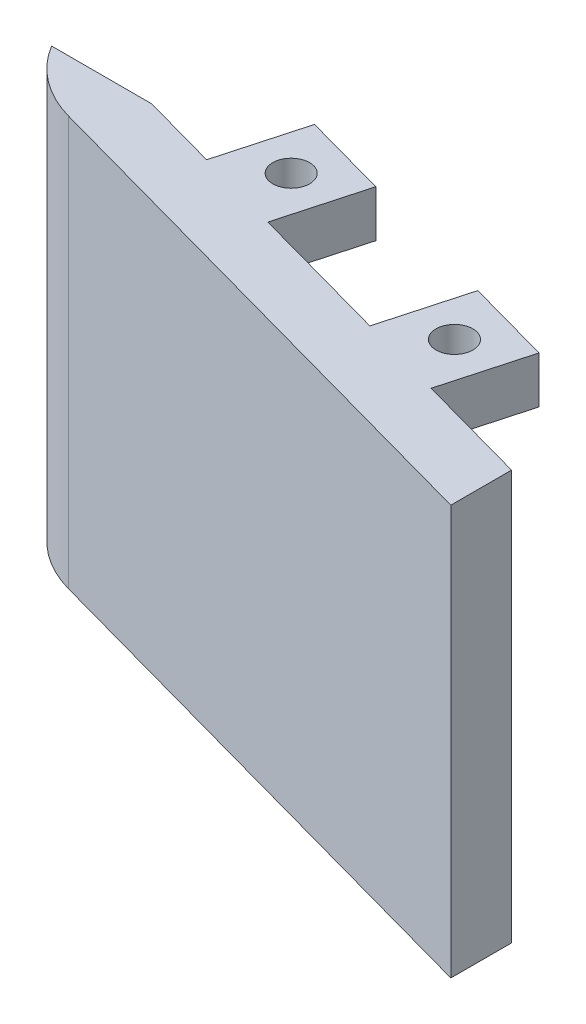
ISO-10303-21;
HEADER;
FILE_DESCRIPTION(('STEP AP214'),'2;1');
FILE_NAME('part.step','',(''),(''),'','','');
FILE_SCHEMA(('AUTOMOTIVE_DESIGN { 1 0 10303 214 1 1 1 1 }'));
ENDSEC;
DATA;
#1=APPLICATION_CONTEXT('core data for automotive mechanical design processes');
#2=APPLICATION_PROTOCOL_DEFINITION('international standard','automotive_design',2000,#1);
#3=PRODUCT_CONTEXT('',#1,'mechanical');
#4=PRODUCT('Part','Part','',(#3));
#5=PRODUCT_RELATED_PRODUCT_CATEGORY('part','',(#4));
#6=PRODUCT_DEFINITION_FORMATION('','',#4);
#7=PRODUCT_DEFINITION_CONTEXT('part definition',#1,'design');
#8=PRODUCT_DEFINITION('design','',#6,#7);
#9=PRODUCT_DEFINITION_SHAPE('','',#8);
#10=(LENGTH_UNIT() NAMED_UNIT(*) SI_UNIT(.MILLI.,.METRE.));
#11=(NAMED_UNIT(*) PLANE_ANGLE_UNIT() SI_UNIT($,.RADIAN.));
#12=(NAMED_UNIT(*) SI_UNIT($,.STERADIAN.) SOLID_ANGLE_UNIT());
#13=UNCERTAINTY_MEASURE_WITH_UNIT(LENGTH_MEASURE(1.E-05),#10,'distance_accuracy_value','');
#14=(GEOMETRIC_REPRESENTATION_CONTEXT(3) GLOBAL_UNCERTAINTY_ASSIGNED_CONTEXT((#13)) GLOBAL_UNIT_ASSIGNED_CONTEXT((#10,
#11,#12)) REPRESENTATION_CONTEXT('',''));
#15=CARTESIAN_POINT('',(0.,0.,0.));
#16=DIRECTION('',(0.,0.,1.));
#17=DIRECTION('',(1.,0.,0.));
#18=AXIS2_PLACEMENT_3D('',#15,#16,#17);
#19=CARTESIAN_POINT('',(0.,70.,0.));
#20=DIRECTION('',(0.,1.,0.));
#21=DIRECTION('',(0.,0.,1.));
#22=AXIS2_PLACEMENT_3D('',#19,#20,#21);
#23=PLANE('',#22);
#24=DIRECTION('',(-0.266223154976055,0.,0.963911423189183));
#25=VECTOR('',#24,1.);
#26=CARTESIAN_POINT('',(99.0479813275226,70.,9.38647380195546));
#27=LINE('',#26,#25);
#28=CARTESIAN_POINT('',(103.041328652163,70.,-5.07219754588228));
#29=VERTEX_POINT('',#28);
#30=CARTESIAN_POINT('',(99.0479813275226,70.,9.386473801966));
#31=VERTEX_POINT('',#30);
#32=EDGE_CURVE('E247',#29,#31,#27,.T.);
#33=ORIENTED_EDGE('',*,*,#32,.T.);
#34=DIRECTION('',(0.963911423189182,0.,0.266223154976056));
#35=VECTOR('',#34,1.);
#36=CARTESIAN_POINT('',(37.4999999999999,70.,-7.61249246944476));
#37=LINE('',#36,#35);
#38=CARTESIAN_POINT('',(74.950195747793,70.,2.73089492755406));
#39=VERTEX_POINT('',#38);
#40=EDGE_CURVE('E180',#39,#31,#37,.T.);
#41=ORIENTED_EDGE('',*,*,#40,.F.);
#42=DIRECTION('',(0.266223154976056,0.,-0.963911423189182));
#43=VECTOR('',#42,1.);
#44=CARTESIAN_POINT('',(78.9435430724339,70.,-11.7277764202837));
#45=LINE('',#44,#43);
#46=CARTESIAN_POINT('',(78.9435430724339,70.,-11.7277764202837));
#47=VERTEX_POINT('',#46);
#48=EDGE_CURVE('E229',#39,#47,#45,.T.);
#49=ORIENTED_EDGE('',*,*,#48,.T.);
#50=DIRECTION('',(-0.963911423189182,0.,-0.266223154976056));
#51=VECTOR('',#50,1.);
#52=CARTESIAN_POINT('',(64.4848717245961,70.,-15.7211237449245));
#53=LINE('',#52,#51);
#54=CARTESIAN_POINT('',(64.4848717245961,70.,-15.7211237449245));
#55=VERTEX_POINT('',#54);
#56=EDGE_CURVE('E155',#47,#55,#53,.T.);
#57=ORIENTED_EDGE('',*,*,#56,.T.);
#58=DIRECTION('',(-0.266223154976056,0.,0.963911423189182));
#59=VECTOR('',#58,1.);
#60=CARTESIAN_POINT('',(60.4915243999553,70.,-1.26245239708677));
#61=LINE('',#60,#59);
#62=CARTESIAN_POINT('',(60.4915243999553,70.,-1.26245239707623));
#63=VERTEX_POINT('',#62);
#64=EDGE_CURVE('E195',#55,#63,#61,.T.);
#65=ORIENTED_EDGE('',*,*,#64,.T.);
#66=CARTESIAN_POINT('',(47.4999999999999,70.,-4.85058770754004));
#67=VERTEX_POINT('',#66);
#68=EDGE_CURVE('E177',#67,#63,#37,.T.);
#69=ORIENTED_EDGE('',*,*,#68,.F.);
#70=DIRECTION('',(-1.,0.,0.));
#71=VECTOR('',#70,1.);
#72=CARTESIAN_POINT('',(0.,70.,-4.85058770754004));
#73=LINE('',#72,#71);
#74=CARTESIAN_POINT('',(30.4011145952091,70.,-4.85058770754004));
#75=VERTEX_POINT('',#74);
#76=EDGE_CURVE('E236',#67,#75,#73,.T.);
#77=ORIENTED_EDGE('',*,*,#76,.T.);
#78=CARTESIAN_POINT('',(47.4999999999999,70.,-15.2249849388895));
#79=DIRECTION('',(0.,1.,0.));
#80=DIRECTION('',(0.,0.,1.));
#81=AXIS2_PLACEMENT_3D('',#78,#79,#80);
#82=CIRCLE('',#81,20.);
#83=CARTESIAN_POINT('',(42.1755369004788,70.,4.05324352489411));
#84=VERTEX_POINT('',#83);
#85=EDGE_CURVE('E223',#75,#84,#82,.T.);
#86=ORIENTED_EDGE('',*,*,#85,.T.);
#87=DIRECTION('',(-0.963911423189182,0.,-0.266223154976055));
#88=VECTOR('',#87,1.);
#89=CARTESIAN_POINT('',(132.500000000002,70.,29.0000000000001));
#90=LINE('',#89,#88);
#91=CARTESIAN_POINT('',(132.500000000002,70.,29.0000000000001));
#92=VERTEX_POINT('',#91);
#93=EDGE_CURVE('E173',#92,#84,#90,.T.);
#94=ORIENTED_EDGE('',*,*,#93,.F.);
#95=DIRECTION('',(0.,0.,1.));
#96=VECTOR('',#95,1.);
#97=CARTESIAN_POINT('',(132.500000000002,70.,18.6256027686506));
#98=LINE('',#97,#96);
#99=CARTESIAN_POINT('',(132.500000000002,70.,18.6256027686506));
#100=VERTEX_POINT('',#99);
#101=EDGE_CURVE('E170',#100,#92,#98,.T.);
#102=ORIENTED_EDGE('',*,*,#101,.F.);
#103=CARTESIAN_POINT('',(113.50665267536,70.,13.3798211265963));
#104=VERTEX_POINT('',#103);
#105=EDGE_CURVE('E181',#104,#100,#37,.T.);
#106=ORIENTED_EDGE('',*,*,#105,.F.);
#107=DIRECTION('',(0.266223154976056,0.,-0.963911423189182));
#108=VECTOR('',#107,1.);
#109=CARTESIAN_POINT('',(117.500000000001,70.,-1.07885022124145));
#110=LINE('',#109,#108);
#111=CARTESIAN_POINT('',(117.500000000001,70.,-1.07885022124145));
#112=VERTEX_POINT('',#111);
#113=EDGE_CURVE('E204',#104,#112,#110,.T.);
#114=ORIENTED_EDGE('',*,*,#113,.T.);
#115=DIRECTION('',(-0.963911423189182,0.,-0.266223154976055));
#116=VECTOR('',#115,1.);
#117=CARTESIAN_POINT('',(103.041328652163,70.,-5.07219754588228));
#118=LINE('',#117,#116);
#119=EDGE_CURVE('E45',#112,#29,#118,.T.);
#120=ORIENTED_EDGE('',*,*,#119,.T.);
#121=EDGE_LOOP('',(#33,#41,#49,#57,#65,#69,#77,#86,#94,#102,#106,#114,#120));
#122=FACE_BOUND('',#121,.T.);
#123=CARTESIAN_POINT('',(108.273990663762,70.,4.153811790357));
#124=DIRECTION('',(0.,1.,0.));
#125=DIRECTION('',(0.,0.,1.));
#126=AXIS2_PLACEMENT_3D('',#123,#124,#125);
#127=CIRCLE('',#126,3.14999999999753);
#128=CARTESIAN_POINT('',(108.273990663762,70.,7.30381179035453));
#129=VERTEX_POINT('',#128);
#130=EDGE_CURVE('E199',#129,#129,#127,.T.);
#131=ORIENTED_EDGE('',*,*,#130,.F.);
#132=EDGE_LOOP('',(#131));
#133=FACE_BOUND('',#132,.T.);
#134=CARTESIAN_POINT('',(69.7175337361946,70.,-6.49511440868522));
#135=DIRECTION('',(0.,1.,0.));
#136=DIRECTION('',(0.,0.,1.));
#137=AXIS2_PLACEMENT_3D('',#134,#135,#136);
#138=CIRCLE('',#137,3.14999999999754);
#139=CARTESIAN_POINT('',(69.7175337361946,70.,-3.34511440868768));
#140=VERTEX_POINT('',#139);
#141=EDGE_CURVE('E191',#140,#140,#138,.T.);
#142=ORIENTED_EDGE('',*,*,#141,.F.);
#143=EDGE_LOOP('',(#142));
#144=FACE_BOUND('',#143,.T.);
#145=ADVANCED_FACE('F42',(#122,#133,#144),#23,.T.);
#146=CARTESIAN_POINT('',(103.041328652163,62.,-5.07219754588228));
#147=DIRECTION('',(0.266223154976055,0.,-0.963911423189183));
#148=DIRECTION('',(-0.963911423189182,0.,-0.266223154976055));
#149=AXIS2_PLACEMENT_3D('',#146,#147,#148);
#150=PLANE('',#149);
#151=ORIENTED_EDGE('',*,*,#119,.F.);
#152=DIRECTION('',(0.,1.,0.));
#153=VECTOR('',#152,1.);
#154=CARTESIAN_POINT('',(117.500000000001,62.,-1.07885022124145));
#155=LINE('',#154,#153);
#156=CARTESIAN_POINT('',(117.500000000001,62.,-1.07885022124145));
#157=VERTEX_POINT('',#156);
#158=EDGE_CURVE('E218',#157,#112,#155,.T.);
#159=ORIENTED_EDGE('',*,*,#158,.F.);
#160=DIRECTION('',(-0.963911423189182,0.,-0.266223154976055));
#161=VECTOR('',#160,1.);
#162=CARTESIAN_POINT('',(103.041328652163,62.,-5.07219754588228));
#163=LINE('',#162,#161);
#164=CARTESIAN_POINT('',(103.041328652163,62.,-5.07219754588228));
#165=VERTEX_POINT('',#164);
#166=EDGE_CURVE('E57',#157,#165,#163,.T.);
#167=ORIENTED_EDGE('',*,*,#166,.T.);
#168=DIRECTION('',(0.,1.,0.));
#169=VECTOR('',#168,1.);
#170=CARTESIAN_POINT('',(103.041328652163,62.,-5.07219754588228));
#171=LINE('',#170,#169);
#172=EDGE_CURVE('E11',#165,#29,#171,.T.);
#173=ORIENTED_EDGE('',*,*,#172,.T.);
#174=EDGE_LOOP('',(#151,#159,#167,#173));
#175=FACE_BOUND('',#174,.T.);
#176=ADVANCED_FACE('F253',(#175),#150,.T.);
#177=CARTESIAN_POINT('',(99.0479813275226,62.,9.38647380195546));
#178=DIRECTION('',(-0.963911423189183,0.,-0.266223154976055));
#179=DIRECTION('',(-0.266223154976055,0.,0.963911423189183));
#180=AXIS2_PLACEMENT_3D('',#177,#178,#179);
#181=PLANE('',#180);
#182=DIRECTION('',(-0.266223154976055,0.,0.963911423189183));
#183=VECTOR('',#182,1.);
#184=CARTESIAN_POINT('',(99.0479813275226,62.,9.38647380195546));
#185=LINE('',#184,#183);
#186=CARTESIAN_POINT('',(99.0479813275226,62.,9.386473801966));
#187=VERTEX_POINT('',#186);
#188=EDGE_CURVE('E51',#165,#187,#185,.T.);
#189=ORIENTED_EDGE('',*,*,#188,.T.);
#190=DIRECTION('',(0.,1.,0.));
#191=VECTOR('',#190,1.);
#192=CARTESIAN_POINT('',(99.0479813275226,62.,9.38647380195546));
#193=LINE('',#192,#191);
#194=EDGE_CURVE('E215',#187,#31,#193,.T.);
#195=ORIENTED_EDGE('',*,*,#194,.T.);
#196=ORIENTED_EDGE('',*,*,#32,.F.);
#197=ORIENTED_EDGE('',*,*,#172,.F.);
#198=EDGE_LOOP('',(#189,#195,#196,#197));
#199=FACE_BOUND('',#198,.T.);
#200=ADVANCED_FACE('F256',(#199),#181,.T.);
#201=CARTESIAN_POINT('',(0.,62.,0.));
#202=DIRECTION('',(0.,-1.,0.));
#203=DIRECTION('',(0.,0.,-1.));
#204=AXIS2_PLACEMENT_3D('',#201,#202,#203);
#205=PLANE('',#204);
#206=ORIENTED_EDGE('',*,*,#166,.F.);
#207=DIRECTION('',(0.266223154976056,0.,-0.963911423189182));
#208=VECTOR('',#207,1.);
#209=CARTESIAN_POINT('',(117.500000000001,62.,-1.07885022124145));
#210=LINE('',#209,#208);
#211=CARTESIAN_POINT('',(113.506652675322,62.,13.3798211265963));
#212=VERTEX_POINT('',#211);
#213=EDGE_CURVE('E209',#212,#157,#210,.T.);
#214=ORIENTED_EDGE('',*,*,#213,.F.);
#215=DIRECTION('',(0.963911423189182,0.,0.266223154976056));
#216=VECTOR('',#215,1.);
#217=CARTESIAN_POINT('',(99.0479813275226,62.,9.38647380195546));
#218=LINE('',#217,#216);
#219=EDGE_CURVE('E207',#187,#212,#218,.T.);
#220=ORIENTED_EDGE('',*,*,#219,.F.);
#221=ORIENTED_EDGE('',*,*,#188,.F.);
#222=EDGE_LOOP('',(#206,#214,#220,#221));
#223=FACE_BOUND('',#222,.T.);
#224=CARTESIAN_POINT('',(108.273990663762,62.,4.153811790357));
#225=DIRECTION('',(0.,1.,0.));
#226=DIRECTION('',(0.,0.,1.));
#227=AXIS2_PLACEMENT_3D('',#224,#225,#226);
#228=CIRCLE('',#227,3.14999999999753);
#229=CARTESIAN_POINT('',(108.273990663762,62.,7.30381179035453));
#230=VERTEX_POINT('',#229);
#231=EDGE_CURVE('E201',#230,#230,#228,.T.);
#232=ORIENTED_EDGE('',*,*,#231,.T.);
#233=EDGE_LOOP('',(#232));
#234=FACE_BOUND('',#233,.T.);
#235=ADVANCED_FACE('F264',(#223,#234),#205,.T.);
#236=CARTESIAN_POINT('',(0.,0.,-4.85058770754004));
#237=DIRECTION('',(0.,0.,-1.));
#238=DIRECTION('',(-1.,0.,0.));
#239=AXIS2_PLACEMENT_3D('',#236,#237,#238);
#240=PLANE('',#239);
#241=DIRECTION('',(0.,-1.,0.));
#242=VECTOR('',#241,1.);
#243=CARTESIAN_POINT('',(47.4999999999999,70.,-4.85058770754004));
#244=LINE('',#243,#242);
#245=CARTESIAN_POINT('',(47.4999999999999,0.,-4.85058770754004));
#246=VERTEX_POINT('',#245);
#247=EDGE_CURVE('E163',#67,#246,#244,.T.);
#248=ORIENTED_EDGE('',*,*,#247,.T.);
#249=DIRECTION('',(-1.,0.,0.));
#250=VECTOR('',#249,1.);
#251=CARTESIAN_POINT('',(0.,0.,-4.85058770754004));
#252=LINE('',#251,#250);
#253=CARTESIAN_POINT('',(30.4011145952091,0.,-4.85058770754004));
#254=VERTEX_POINT('',#253);
#255=EDGE_CURVE('E239',#246,#254,#252,.T.);
#256=ORIENTED_EDGE('',*,*,#255,.T.);
#257=DIRECTION('',(0.,-1.,0.));
#258=VECTOR('',#257,1.);
#259=CARTESIAN_POINT('',(30.4011145952091,70.,-4.85058770754004));
#260=LINE('',#259,#258);
#261=EDGE_CURVE('E225',#75,#254,#260,.T.);
#262=ORIENTED_EDGE('',*,*,#261,.F.);
#263=ORIENTED_EDGE('',*,*,#76,.F.);
#264=EDGE_LOOP('',(#248,#256,#262,#263));
#265=FACE_BOUND('',#264,.T.);
#266=ADVANCED_FACE('F285',(#265),#240,.T.);
#267=CARTESIAN_POINT('',(132.500000000002,70.,18.6256027686506));
#268=DIRECTION('',(1.,0.,0.));
#269=DIRECTION('',(0.,0.,-1.));
#270=AXIS2_PLACEMENT_3D('',#267,#268,#269);
#271=PLANE('',#270);
#272=DIRECTION('',(0.,0.,1.));
#273=VECTOR('',#272,1.);
#274=CARTESIAN_POINT('',(132.500000000002,0.,18.6256027686506));
#275=LINE('',#274,#273);
#276=CARTESIAN_POINT('',(132.500000000002,0.,18.6256027686506));
#277=VERTEX_POINT('',#276);
#278=CARTESIAN_POINT('',(132.500000000002,0.,29.0000000000001));
#279=VERTEX_POINT('',#278);
#280=EDGE_CURVE('E168',#277,#279,#275,.T.);
#281=ORIENTED_EDGE('',*,*,#280,.F.);
#282=DIRECTION('',(0.,-1.,0.));
#283=VECTOR('',#282,1.);
#284=CARTESIAN_POINT('',(132.500000000002,70.,18.6256027686506));
#285=LINE('',#284,#283);
#286=EDGE_CURVE('E188',#100,#277,#285,.T.);
#287=ORIENTED_EDGE('',*,*,#286,.F.);
#288=ORIENTED_EDGE('',*,*,#101,.T.);
#289=DIRECTION('',(0.,-1.,0.));
#290=VECTOR('',#289,1.);
#291=CARTESIAN_POINT('',(132.500000000002,70.,29.0000000000001));
#292=LINE('',#291,#290);
#293=EDGE_CURVE('E192',#92,#279,#292,.T.);
#294=ORIENTED_EDGE('',*,*,#293,.T.);
#295=EDGE_LOOP('',(#281,#287,#288,#294));
#296=FACE_BOUND('',#295,.T.);
#297=ADVANCED_FACE('F272',(#296),#271,.T.);
#298=CARTESIAN_POINT('',(132.500000000002,70.,29.0000000000001));
#299=DIRECTION('',(-0.266223154976055,0.,0.963911423189182));
#300=DIRECTION('',(0.963911423189182,0.,0.266223154976055));
#301=AXIS2_PLACEMENT_3D('',#298,#299,#300);
#302=PLANE('',#301);
#303=ORIENTED_EDGE('',*,*,#93,.T.);
#304=DIRECTION('',(0.,-1.,0.));
#305=VECTOR('',#304,1.);
#306=CARTESIAN_POINT('',(42.1755369004788,70.,4.05324352489411));
#307=LINE('',#306,#305);
#308=CARTESIAN_POINT('',(42.1755369004788,0.,4.05324352489411));
#309=VERTEX_POINT('',#308);
#310=EDGE_CURVE('E165',#84,#309,#307,.T.);
#311=ORIENTED_EDGE('',*,*,#310,.T.);
#312=DIRECTION('',(-0.963911423189182,0.,-0.266223154976055));
#313=VECTOR('',#312,1.);
#314=CARTESIAN_POINT('',(132.500000000002,0.,29.0000000000001));
#315=LINE('',#314,#313);
#316=EDGE_CURVE('E184',#279,#309,#315,.T.);
#317=ORIENTED_EDGE('',*,*,#316,.F.);
#318=ORIENTED_EDGE('',*,*,#293,.F.);
#319=EDGE_LOOP('',(#303,#311,#317,#318));
#320=FACE_BOUND('',#319,.T.);
#321=ADVANCED_FACE('F276',(#320),#302,.T.);
#322=CARTESIAN_POINT('',(0.,0.,0.));
#323=DIRECTION('',(0.,1.,0.));
#324=DIRECTION('',(0.,0.,1.));
#325=AXIS2_PLACEMENT_3D('',#322,#323,#324);
#326=PLANE('',#325);
#327=ORIENTED_EDGE('',*,*,#255,.F.);
#328=DIRECTION('',(0.963911423189182,0.,0.266223154976056));
#329=VECTOR('',#328,1.);
#330=CARTESIAN_POINT('',(37.4999999999999,0.,-7.61249246944476));
#331=LINE('',#330,#329);
#332=EDGE_CURVE('E174',#246,#277,#331,.T.);
#333=ORIENTED_EDGE('',*,*,#332,.T.);
#334=ORIENTED_EDGE('',*,*,#280,.T.);
#335=ORIENTED_EDGE('',*,*,#316,.T.);
#336=CARTESIAN_POINT('',(47.4999999999999,0.,-15.2249849388895));
#337=DIRECTION('',(0.,1.,0.));
#338=DIRECTION('',(0.,0.,1.));
#339=AXIS2_PLACEMENT_3D('',#336,#337,#338);
#340=CIRCLE('',#339,20.);
#341=EDGE_CURVE('E169',#309,#254,#340,.F.);
#342=ORIENTED_EDGE('',*,*,#341,.T.);
#343=EDGE_LOOP('',(#327,#333,#334,#335,#342));
#344=FACE_BOUND('',#343,.T.);
#345=ADVANCED_FACE('F283',(#344),#326,.F.);
#346=CARTESIAN_POINT('',(78.9435430724339,62.,-11.7277764202837));
#347=DIRECTION('',(0.963911423189182,0.,0.266223154976056));
#348=DIRECTION('',(0.266223154976056,0.,-0.963911423189182));
#349=AXIS2_PLACEMENT_3D('',#346,#347,#348);
#350=PLANE('',#349);
#351=DIRECTION('',(0.266223154976056,0.,-0.963911423189182));
#352=VECTOR('',#351,1.);
#353=CARTESIAN_POINT('',(78.9435430724339,62.,-11.7277764202837));
#354=LINE('',#353,#352);
#355=CARTESIAN_POINT('',(74.9501957477549,62.,2.73089492755407));
#356=VERTEX_POINT('',#355);
#357=CARTESIAN_POINT('',(78.9435430724339,62.,-11.7277764202837));
#358=VERTEX_POINT('',#357);
#359=EDGE_CURVE('E135',#356,#358,#354,.T.);
#360=ORIENTED_EDGE('',*,*,#359,.T.);
#361=DIRECTION('',(0.,1.,0.));
#362=VECTOR('',#361,1.);
#363=CARTESIAN_POINT('',(78.9435430724339,62.,-11.7277764202837));
#364=LINE('',#363,#362);
#365=EDGE_CURVE('E139',#358,#47,#364,.T.);
#366=ORIENTED_EDGE('',*,*,#365,.T.);
#367=ORIENTED_EDGE('',*,*,#48,.F.);
#368=DIRECTION('',(0.,1.,0.));
#369=VECTOR('',#368,1.);
#370=CARTESIAN_POINT('',(74.950195747793,62.,2.73089492755406));
#371=LINE('',#370,#369);
#372=EDGE_CURVE('E142',#356,#39,#371,.T.);
#373=ORIENTED_EDGE('',*,*,#372,.F.);
#374=EDGE_LOOP('',(#360,#366,#367,#373));
#375=FACE_BOUND('',#374,.T.);
#376=ADVANCED_FACE('F137',(#375),#350,.T.);
#377=CARTESIAN_POINT('',(60.4915243999553,62.,-1.26245239708677));
#378=DIRECTION('',(-0.963911423189182,0.,-0.266223154976056));
#379=DIRECTION('',(-0.266223154976056,0.,0.963911423189182));
#380=AXIS2_PLACEMENT_3D('',#377,#378,#379);
#381=PLANE('',#380);
#382=ORIENTED_EDGE('',*,*,#64,.F.);
#383=DIRECTION('',(0.,1.,0.));
#384=VECTOR('',#383,1.);
#385=CARTESIAN_POINT('',(64.4848717245961,62.,-15.7211237449245));
#386=LINE('',#385,#384);
#387=CARTESIAN_POINT('',(64.4848717245961,62.,-15.7211237449245));
#388=VERTEX_POINT('',#387);
#389=EDGE_CURVE('E156',#388,#55,#386,.T.);
#390=ORIENTED_EDGE('',*,*,#389,.F.);
#391=DIRECTION('',(-0.266223154976056,0.,0.963911423189182));
#392=VECTOR('',#391,1.);
#393=CARTESIAN_POINT('',(60.4915243999553,62.,-1.26245239708677));
#394=LINE('',#393,#392);
#395=CARTESIAN_POINT('',(60.4915243999553,62.,-1.26245239707623));
#396=VERTEX_POINT('',#395);
#397=EDGE_CURVE('E146',#388,#396,#394,.T.);
#398=ORIENTED_EDGE('',*,*,#397,.T.);
#399=DIRECTION('',(0.,1.,0.));
#400=VECTOR('',#399,1.);
#401=CARTESIAN_POINT('',(60.4915243999553,62.,-1.26245239708677));
#402=LINE('',#401,#400);
#403=EDGE_CURVE('E196',#396,#63,#402,.T.);
#404=ORIENTED_EDGE('',*,*,#403,.T.);
#405=EDGE_LOOP('',(#382,#390,#398,#404));
#406=FACE_BOUND('',#405,.T.);
#407=ADVANCED_FACE('F290',(#406),#381,.T.);
#408=CARTESIAN_POINT('',(0.,62.,0.));
#409=DIRECTION('',(0.,-1.,0.));
#410=DIRECTION('',(0.,0.,-1.));
#411=AXIS2_PLACEMENT_3D('',#408,#409,#410);
#412=PLANE('',#411);
#413=CARTESIAN_POINT('',(69.7175337361946,62.,-6.49511440868522));
#414=DIRECTION('',(0.,1.,0.));
#415=DIRECTION('',(0.,0.,1.));
#416=AXIS2_PLACEMENT_3D('',#413,#414,#415);
#417=CIRCLE('',#416,3.14999999999754);
#418=CARTESIAN_POINT('',(69.7175337361946,62.,-3.34511440868768));
#419=VERTEX_POINT('',#418);
#420=EDGE_CURVE('E231',#419,#419,#417,.T.);
#421=ORIENTED_EDGE('',*,*,#420,.T.);
#422=EDGE_LOOP('',(#421));
#423=FACE_BOUND('',#422,.T.);
#424=ORIENTED_EDGE('',*,*,#397,.F.);
#425=DIRECTION('',(-0.963911423189182,0.,-0.266223154976056));
#426=VECTOR('',#425,1.);
#427=CARTESIAN_POINT('',(64.4848717245961,62.,-15.7211237449245));
#428=LINE('',#427,#426);
#429=EDGE_CURVE('E153',#358,#388,#428,.T.);
#430=ORIENTED_EDGE('',*,*,#429,.F.);
#431=ORIENTED_EDGE('',*,*,#359,.F.);
#432=DIRECTION('',(0.963911423189183,0.,0.266223154976055));
#433=VECTOR('',#432,1.);
#434=CARTESIAN_POINT('',(60.4915243999553,62.,-1.26245239708677));
#435=LINE('',#434,#433);
#436=EDGE_CURVE('E147',#396,#356,#435,.T.);
#437=ORIENTED_EDGE('',*,*,#436,.F.);
#438=EDGE_LOOP('',(#424,#430,#431,#437));
#439=FACE_BOUND('',#438,.T.);
#440=ADVANCED_FACE('F158',(#423,#439),#412,.T.);
#441=CARTESIAN_POINT('',(37.4999999999999,70.,-7.61249246944476));
#442=DIRECTION('',(0.266223154976056,0.,-0.963911423189182));
#443=DIRECTION('',(-0.963911423189182,0.,-0.266223154976056));
#444=AXIS2_PLACEMENT_3D('',#441,#442,#443);
#445=PLANE('',#444);
#446=ORIENTED_EDGE('',*,*,#194,.F.);
#447=ORIENTED_EDGE('',*,*,#219,.T.);
#448=DIRECTION('',(0.,1.,0.));
#449=VECTOR('',#448,1.);
#450=CARTESIAN_POINT('',(113.50665267536,62.,13.3798211265963));
#451=LINE('',#450,#449);
#452=EDGE_CURVE('E212',#212,#104,#451,.T.);
#453=ORIENTED_EDGE('',*,*,#452,.T.);
#454=ORIENTED_EDGE('',*,*,#105,.T.);
#455=ORIENTED_EDGE('',*,*,#286,.T.);
#456=ORIENTED_EDGE('',*,*,#332,.F.);
#457=ORIENTED_EDGE('',*,*,#247,.F.);
#458=ORIENTED_EDGE('',*,*,#68,.T.);
#459=ORIENTED_EDGE('',*,*,#403,.F.);
#460=ORIENTED_EDGE('',*,*,#436,.T.);
#461=ORIENTED_EDGE('',*,*,#372,.T.);
#462=ORIENTED_EDGE('',*,*,#40,.T.);
#463=EDGE_LOOP('',(#446,#447,#453,#454,#455,#456,#457,#458,#459,#460,#461,#462));
#464=FACE_BOUND('',#463,.T.);
#465=ADVANCED_FACE('F260',(#464),#445,.T.);
#466=CARTESIAN_POINT('',(117.500000000001,62.,-1.07885022124145));
#467=DIRECTION('',(0.963911423189183,0.,0.266223154976056));
#468=DIRECTION('',(0.266223154976056,0.,-0.963911423189182));
#469=AXIS2_PLACEMENT_3D('',#466,#467,#468);
#470=PLANE('',#469);
#471=ORIENTED_EDGE('',*,*,#113,.F.);
#472=ORIENTED_EDGE('',*,*,#452,.F.);
#473=ORIENTED_EDGE('',*,*,#213,.T.);
#474=ORIENTED_EDGE('',*,*,#158,.T.);
#475=EDGE_LOOP('',(#471,#472,#473,#474));
#476=FACE_BOUND('',#475,.T.);
#477=ADVANCED_FACE('F267',(#476),#470,.T.);
#478=CARTESIAN_POINT('',(108.273990663762,62.,4.153811790357));
#479=DIRECTION('',(0.,1.,0.));
#480=DIRECTION('',(0.,0.,1.));
#481=AXIS2_PLACEMENT_3D('',#478,#479,#480);
#482=CYLINDRICAL_SURFACE('',#481,3.14999999999753);
#483=ORIENTED_EDGE('',*,*,#231,.F.);
#484=EDGE_LOOP('',(#483));
#485=FACE_BOUND('',#484,.T.);
#486=ORIENTED_EDGE('',*,*,#130,.T.);
#487=EDGE_LOOP('',(#486));
#488=FACE_BOUND('',#487,.T.);
#489=ADVANCED_FACE('F323',(#485,#488),#482,.F.);
#490=CARTESIAN_POINT('',(69.7175337361946,62.,-6.49511440868522));
#491=DIRECTION('',(0.,1.,0.));
#492=DIRECTION('',(0.,0.,1.));
#493=AXIS2_PLACEMENT_3D('',#490,#491,#492);
#494=CYLINDRICAL_SURFACE('',#493,3.14999999999754);
#495=ORIENTED_EDGE('',*,*,#420,.F.);
#496=EDGE_LOOP('',(#495));
#497=FACE_BOUND('',#496,.T.);
#498=ORIENTED_EDGE('',*,*,#141,.T.);
#499=EDGE_LOOP('',(#498));
#500=FACE_BOUND('',#499,.T.);
#501=ADVANCED_FACE('F326',(#497,#500),#494,.F.);
#502=CARTESIAN_POINT('',(47.4999999999999,70.,-15.2249849388895));
#503=DIRECTION('',(0.,-1.,0.));
#504=DIRECTION('',(0.,0.,-1.));
#505=AXIS2_PLACEMENT_3D('',#502,#503,#504);
#506=CYLINDRICAL_SURFACE('',#505,20.);
#507=ORIENTED_EDGE('',*,*,#85,.F.);
#508=ORIENTED_EDGE('',*,*,#261,.T.);
#509=ORIENTED_EDGE('',*,*,#341,.F.);
#510=ORIENTED_EDGE('',*,*,#310,.F.);
#511=EDGE_LOOP('',(#507,#508,#509,#510));
#512=FACE_BOUND('',#511,.T.);
#513=ADVANCED_FACE('F279',(#512),#506,.T.);
#514=CARTESIAN_POINT('',(64.4848717245961,62.,-15.7211237449245));
#515=DIRECTION('',(0.266223154976056,0.,-0.963911423189182));
#516=DIRECTION('',(-0.963911423189182,0.,-0.266223154976056));
#517=AXIS2_PLACEMENT_3D('',#514,#515,#516);
#518=PLANE('',#517);
#519=ORIENTED_EDGE('',*,*,#56,.F.);
#520=ORIENTED_EDGE('',*,*,#365,.F.);
#521=ORIENTED_EDGE('',*,*,#429,.T.);
#522=ORIENTED_EDGE('',*,*,#389,.T.);
#523=EDGE_LOOP('',(#519,#520,#521,#522));
#524=FACE_BOUND('',#523,.T.);
#525=ADVANCED_FACE('F151',(#524),#518,.T.);
#526=CLOSED_SHELL('',(#145,#176,#200,#235,#266,#297,#321,#345,#376,#407,#440,#465,#477,#489,
#501,#513,#525));
#527=MANIFOLD_SOLID_BREP('B2',#526);
#528=ADVANCED_BREP_SHAPE_REPRESENTATION('',(#18,#527),#14);
#529=SHAPE_DEFINITION_REPRESENTATION(#9,#528);
ENDSEC;
END-ISO-10303-21;
